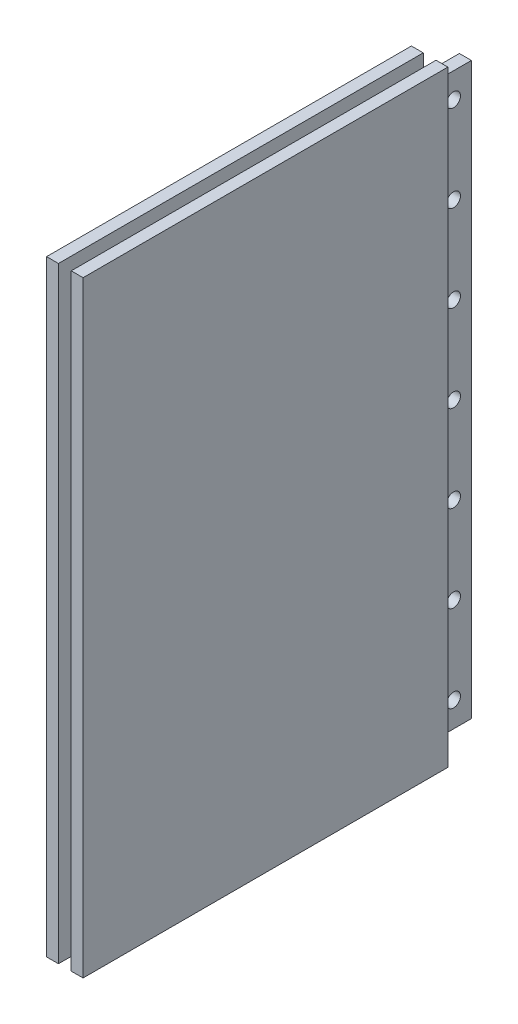
ISO-10303-21;
HEADER;
FILE_DESCRIPTION(('STEP AP214'),'2;1');
FILE_NAME('part.step','',(''),(''),'','','');
FILE_SCHEMA(('AUTOMOTIVE_DESIGN { 1 0 10303 214 1 1 1 1 }'));
ENDSEC;
DATA;
#1=APPLICATION_CONTEXT('core data for automotive mechanical design processes');
#2=APPLICATION_PROTOCOL_DEFINITION('international standard','automotive_design',2000,#1);
#3=PRODUCT_CONTEXT('',#1,'mechanical');
#4=PRODUCT('Part','Part','',(#3));
#5=PRODUCT_RELATED_PRODUCT_CATEGORY('part','',(#4));
#6=PRODUCT_DEFINITION_FORMATION('','',#4);
#7=PRODUCT_DEFINITION_CONTEXT('part definition',#1,'design');
#8=PRODUCT_DEFINITION('design','',#6,#7);
#9=PRODUCT_DEFINITION_SHAPE('','',#8);
#10=(LENGTH_UNIT() NAMED_UNIT(*) SI_UNIT(.MILLI.,.METRE.));
#11=(NAMED_UNIT(*) PLANE_ANGLE_UNIT() SI_UNIT($,.RADIAN.));
#12=(NAMED_UNIT(*) SI_UNIT($,.STERADIAN.) SOLID_ANGLE_UNIT());
#13=UNCERTAINTY_MEASURE_WITH_UNIT(LENGTH_MEASURE(1.E-05),#10,'distance_accuracy_value','');
#14=(GEOMETRIC_REPRESENTATION_CONTEXT(3) GLOBAL_UNCERTAINTY_ASSIGNED_CONTEXT((#13)) GLOBAL_UNIT_ASSIGNED_CONTEXT((#10,
#11,#12)) REPRESENTATION_CONTEXT('',''));
#15=CARTESIAN_POINT('',(0.,0.,0.));
#16=DIRECTION('',(0.,0.,1.));
#17=DIRECTION('',(1.,0.,0.));
#18=AXIS2_PLACEMENT_3D('',#15,#16,#17);
#19=CARTESIAN_POINT('',(-10.,0.,0.));
#20=DIRECTION('',(-1.,0.,0.));
#21=DIRECTION('',(0.,0.,1.));
#22=AXIS2_PLACEMENT_3D('',#19,#20,#21);
#23=PLANE('',#22);
#24=DIRECTION('',(0.,-1.,0.));
#25=VECTOR('',#24,1.);
#26=CARTESIAN_POINT('',(-10.,9.99999999999999,92.5));
#27=LINE('',#26,#25);
#28=CARTESIAN_POINT('',(-10.,158.75,92.5));
#29=VERTEX_POINT('',#28);
#30=CARTESIAN_POINT('',(-10.,7.49999999999996,92.5));
#31=VERTEX_POINT('',#30);
#32=EDGE_CURVE('E365',#29,#31,#27,.T.);
#33=ORIENTED_EDGE('',*,*,#32,.T.);
#34=DIRECTION('',(0.,0.,-1.));
#35=VECTOR('',#34,1.);
#36=CARTESIAN_POINT('',(-10.,7.49999999999997,0.));
#37=LINE('',#36,#35);
#38=CARTESIAN_POINT('',(-10.,7.49999999999997,2.49999999999997));
#39=VERTEX_POINT('',#38);
#40=EDGE_CURVE('E11',#31,#39,#37,.T.);
#41=ORIENTED_EDGE('',*,*,#40,.T.);
#42=DIRECTION('',(0.,1.,0.));
#43=VECTOR('',#42,1.);
#44=CARTESIAN_POINT('',(-10.,0.,2.49999999999997));
#45=LINE('',#44,#43);
#46=CARTESIAN_POINT('',(-10.,158.75,2.49999999999997));
#47=VERTEX_POINT('',#46);
#48=EDGE_CURVE('E51',#39,#47,#45,.T.);
#49=ORIENTED_EDGE('',*,*,#48,.T.);
#50=DIRECTION('',(0.,0.,1.));
#51=VECTOR('',#50,1.);
#52=CARTESIAN_POINT('',(-10.,158.75,90.));
#53=LINE('',#52,#51);
#54=EDGE_CURVE('E367',#47,#29,#53,.T.);
#55=ORIENTED_EDGE('',*,*,#54,.T.);
#56=EDGE_LOOP('',(#33,#41,#49,#55));
#57=FACE_BOUND('',#56,.T.);
#58=DIRECTION('',(0.,0.,-1.));
#59=VECTOR('',#58,1.);
#60=CARTESIAN_POINT('',(-10.,0.,0.));
#61=LINE('',#60,#59);
#62=CARTESIAN_POINT('',(-10.,0.,100.));
#63=VERTEX_POINT('',#62);
#64=CARTESIAN_POINT('',(-10.,0.,0.));
#65=VERTEX_POINT('',#64);
#66=EDGE_CURVE('E286',#63,#65,#61,.T.);
#67=ORIENTED_EDGE('',*,*,#66,.F.);
#68=DIRECTION('',(0.,-1.,0.));
#69=VECTOR('',#68,1.);
#70=CARTESIAN_POINT('',(-10.,0.,100.));
#71=LINE('',#70,#69);
#72=CARTESIAN_POINT('',(-10.,166.25,100.));
#73=VERTEX_POINT('',#72);
#74=EDGE_CURVE('E296',#73,#63,#71,.T.);
#75=ORIENTED_EDGE('',*,*,#74,.F.);
#76=DIRECTION('',(0.,0.,1.));
#77=VECTOR('',#76,1.);
#78=CARTESIAN_POINT('',(-10.,166.25,0.));
#79=LINE('',#78,#77);
#80=CARTESIAN_POINT('',(-10.,166.25,0.));
#81=VERTEX_POINT('',#80);
#82=EDGE_CURVE('E293',#81,#73,#79,.T.);
#83=ORIENTED_EDGE('',*,*,#82,.F.);
#84=DIRECTION('',(0.,1.,0.));
#85=VECTOR('',#84,1.);
#86=CARTESIAN_POINT('',(-10.,0.,0.));
#87=LINE('',#86,#85);
#88=EDGE_CURVE('E289',#65,#81,#87,.T.);
#89=ORIENTED_EDGE('',*,*,#88,.F.);
#90=EDGE_LOOP('',(#67,#75,#83,#89));
#91=FACE_BOUND('',#90,.T.);
#92=ADVANCED_FACE('F41',(#57,#91),#23,.T.);
#93=CARTESIAN_POINT('',(-10.,0.,100.));
#94=DIRECTION('',(0.,0.,1.));
#95=DIRECTION('',(1.,0.,0.));
#96=AXIS2_PLACEMENT_3D('',#93,#94,#95);
#97=PLANE('',#96);
#98=DIRECTION('',(1.,0.,0.));
#99=VECTOR('',#98,1.);
#100=CARTESIAN_POINT('',(-10.,0.,100.));
#101=LINE('',#100,#99);
#102=CARTESIAN_POINT('',(-6.74999999999999,0.,100.));
#103=VERTEX_POINT('',#102);
#104=EDGE_CURVE('E310',#63,#103,#101,.T.);
#105=ORIENTED_EDGE('',*,*,#104,.T.);
#106=DIRECTION('',(0.,1.,0.));
#107=VECTOR('',#106,1.);
#108=CARTESIAN_POINT('',(-6.74999999999999,161.25,100.));
#109=LINE('',#108,#107);
#110=CARTESIAN_POINT('',(-6.74999999999999,166.25,100.));
#111=VERTEX_POINT('',#110);
#112=EDGE_CURVE('E259',#103,#111,#109,.T.);
#113=ORIENTED_EDGE('',*,*,#112,.T.);
#114=DIRECTION('',(1.,0.,0.));
#115=VECTOR('',#114,1.);
#116=CARTESIAN_POINT('',(-10.,166.25,100.));
#117=LINE('',#116,#115);
#118=EDGE_CURVE('E315',#73,#111,#117,.T.);
#119=ORIENTED_EDGE('',*,*,#118,.F.);
#120=ORIENTED_EDGE('',*,*,#74,.T.);
#121=EDGE_LOOP('',(#105,#113,#119,#120));
#122=FACE_BOUND('',#121,.T.);
#123=ADVANCED_FACE('F377',(#122),#97,.T.);
#124=CARTESIAN_POINT('',(0.,161.25,0.));
#125=DIRECTION('',(0.,-1.,0.));
#126=DIRECTION('',(0.,0.,-1.));
#127=AXIS2_PLACEMENT_3D('',#124,#125,#126);
#128=PLANE('',#127);
#129=DIRECTION('',(-1.,0.,0.));
#130=VECTOR('',#129,1.);
#131=CARTESIAN_POINT('',(-6.75,161.25,95.));
#132=LINE('',#131,#130);
#133=CARTESIAN_POINT('',(-3.25,161.25,95.));
#134=VERTEX_POINT('',#133);
#135=CARTESIAN_POINT('',(-6.75,161.25,95.));
#136=VERTEX_POINT('',#135);
#137=EDGE_CURVE('E210',#134,#136,#132,.T.);
#138=ORIENTED_EDGE('',*,*,#137,.F.);
#139=DIRECTION('',(0.,0.,-1.));
#140=VECTOR('',#139,1.);
#141=CARTESIAN_POINT('',(-3.24999999999999,161.25,100.));
#142=LINE('',#141,#140);
#143=CARTESIAN_POINT('',(-3.25000000000001,161.25,0.));
#144=VERTEX_POINT('',#143);
#145=EDGE_CURVE('E257',#134,#144,#142,.T.);
#146=ORIENTED_EDGE('',*,*,#145,.T.);
#147=DIRECTION('',(-1.,0.,0.));
#148=VECTOR('',#147,1.);
#149=CARTESIAN_POINT('',(-10.,161.25,0.));
#150=LINE('',#149,#148);
#151=CARTESIAN_POINT('',(-3.35,161.25,0.));
#152=VERTEX_POINT('',#151);
#153=EDGE_CURVE('E264',#144,#152,#150,.T.);
#154=ORIENTED_EDGE('',*,*,#153,.T.);
#155=DIRECTION('',(0.,0.,-1.));
#156=VECTOR('',#155,1.);
#157=CARTESIAN_POINT('',(-3.35,161.25,-9.8));
#158=LINE('',#157,#156);
#159=CARTESIAN_POINT('',(-3.35,161.25,-9.8));
#160=VERTEX_POINT('',#159);
#161=EDGE_CURVE('E313',#152,#160,#158,.T.);
#162=ORIENTED_EDGE('',*,*,#161,.T.);
#163=DIRECTION('',(-1.,0.,0.));
#164=VECTOR('',#163,1.);
#165=CARTESIAN_POINT('',(-3.25000000000001,161.25,-9.8));
#166=LINE('',#165,#164);
#167=CARTESIAN_POINT('',(-6.65,161.25,-9.8));
#168=VERTEX_POINT('',#167);
#169=EDGE_CURVE('E250',#160,#168,#166,.T.);
#170=ORIENTED_EDGE('',*,*,#169,.T.);
#171=DIRECTION('',(0.,0.,1.));
#172=VECTOR('',#171,1.);
#173=CARTESIAN_POINT('',(-6.65,161.25,-9.8));
#174=LINE('',#173,#172);
#175=CARTESIAN_POINT('',(-6.65,161.25,0.));
#176=VERTEX_POINT('',#175);
#177=EDGE_CURVE('E269',#168,#176,#174,.T.);
#178=ORIENTED_EDGE('',*,*,#177,.T.);
#179=DIRECTION('',(-1.,0.,0.));
#180=VECTOR('',#179,1.);
#181=CARTESIAN_POINT('',(-10.,161.25,0.));
#182=LINE('',#181,#180);
#183=CARTESIAN_POINT('',(-6.75,161.25,0.));
#184=VERTEX_POINT('',#183);
#185=EDGE_CURVE('E272',#176,#184,#182,.T.);
#186=ORIENTED_EDGE('',*,*,#185,.T.);
#187=DIRECTION('',(0.,0.,1.));
#188=VECTOR('',#187,1.);
#189=CARTESIAN_POINT('',(-6.74999999999999,161.25,100.));
#190=LINE('',#189,#188);
#191=EDGE_CURVE('E253',#184,#136,#190,.T.);
#192=ORIENTED_EDGE('',*,*,#191,.T.);
#193=EDGE_LOOP('',(#138,#146,#154,#162,#170,#178,#186,#192));
#194=FACE_BOUND('',#193,.T.);
#195=ADVANCED_FACE('F401',(#194),#128,.F.);
#196=CARTESIAN_POINT('',(0.,5.,0.));
#197=DIRECTION('',(0.,1.,0.));
#198=DIRECTION('',(0.,0.,-1.));
#199=AXIS2_PLACEMENT_3D('',#196,#197,#198);
#200=PLANE('',#199);
#201=DIRECTION('',(1.,0.,0.));
#202=VECTOR('',#201,1.);
#203=CARTESIAN_POINT('',(-6.75,5.,95.));
#204=LINE('',#203,#202);
#205=CARTESIAN_POINT('',(-6.74999999999999,5.,95.));
#206=VERTEX_POINT('',#205);
#207=CARTESIAN_POINT('',(-3.25,5.,95.));
#208=VERTEX_POINT('',#207);
#209=EDGE_CURVE('E205',#206,#208,#204,.T.);
#210=ORIENTED_EDGE('',*,*,#209,.F.);
#211=DIRECTION('',(0.,0.,1.));
#212=VECTOR('',#211,1.);
#213=CARTESIAN_POINT('',(-6.74999999999999,5.,100.));
#214=LINE('',#213,#212);
#215=CARTESIAN_POINT('',(-6.75,5.,0.));
#216=VERTEX_POINT('',#215);
#217=EDGE_CURVE('E232',#216,#206,#214,.T.);
#218=ORIENTED_EDGE('',*,*,#217,.F.);
#219=DIRECTION('',(1.,0.,0.));
#220=VECTOR('',#219,1.);
#221=CARTESIAN_POINT('',(-10.,5.,0.));
#222=LINE('',#221,#220);
#223=CARTESIAN_POINT('',(-6.65,5.,0.));
#224=VERTEX_POINT('',#223);
#225=EDGE_CURVE('E244',#216,#224,#222,.T.);
#226=ORIENTED_EDGE('',*,*,#225,.T.);
#227=DIRECTION('',(0.,0.,-1.));
#228=VECTOR('',#227,1.);
#229=CARTESIAN_POINT('',(-6.65,5.,-9.8));
#230=LINE('',#229,#228);
#231=CARTESIAN_POINT('',(-6.65,5.,-9.8));
#232=VERTEX_POINT('',#231);
#233=EDGE_CURVE('E242',#224,#232,#230,.T.);
#234=ORIENTED_EDGE('',*,*,#233,.T.);
#235=DIRECTION('',(-1.,0.,0.));
#236=VECTOR('',#235,1.);
#237=CARTESIAN_POINT('',(-3.25000000000001,5.,-9.8));
#238=LINE('',#237,#236);
#239=CARTESIAN_POINT('',(-3.35,5.,-9.8));
#240=VERTEX_POINT('',#239);
#241=EDGE_CURVE('E226',#240,#232,#238,.T.);
#242=ORIENTED_EDGE('',*,*,#241,.F.);
#243=DIRECTION('',(0.,0.,1.));
#244=VECTOR('',#243,1.);
#245=CARTESIAN_POINT('',(-3.35,5.,-9.8));
#246=LINE('',#245,#244);
#247=CARTESIAN_POINT('',(-3.35,5.,0.));
#248=VERTEX_POINT('',#247);
#249=EDGE_CURVE('E330',#240,#248,#246,.T.);
#250=ORIENTED_EDGE('',*,*,#249,.T.);
#251=DIRECTION('',(1.,0.,0.));
#252=VECTOR('',#251,1.);
#253=CARTESIAN_POINT('',(-10.,5.,0.));
#254=LINE('',#253,#252);
#255=CARTESIAN_POINT('',(-3.25000000000001,5.,0.));
#256=VERTEX_POINT('',#255);
#257=EDGE_CURVE('E235',#248,#256,#254,.T.);
#258=ORIENTED_EDGE('',*,*,#257,.T.);
#259=DIRECTION('',(0.,0.,-1.));
#260=VECTOR('',#259,1.);
#261=CARTESIAN_POINT('',(-3.24999999999999,5.,100.));
#262=LINE('',#261,#260);
#263=EDGE_CURVE('E229',#208,#256,#262,.T.);
#264=ORIENTED_EDGE('',*,*,#263,.F.);
#265=EDGE_LOOP('',(#210,#218,#226,#234,#242,#250,#258,#264));
#266=FACE_BOUND('',#265,.T.);
#267=ADVANCED_FACE('F411',(#266),#200,.F.);
#268=CARTESIAN_POINT('',(-10.001,154.375,-4.9));
#269=DIRECTION('',(1.,0.,0.));
#270=DIRECTION('',(0.,0.,-1.));
#271=AXIS2_PLACEMENT_3D('',#268,#269,#270);
#272=CYLINDRICAL_SURFACE('',#271,1.9);
#273=CARTESIAN_POINT('',(-6.65,154.375,-4.9));
#274=DIRECTION('',(-1.,0.,0.));
#275=DIRECTION('',(0.,0.,1.));
#276=AXIS2_PLACEMENT_3D('',#273,#274,#275);
#277=CIRCLE('',#276,1.9);
#278=CARTESIAN_POINT('',(-6.65,154.375,-3.));
#279=VERTEX_POINT('',#278);
#280=EDGE_CURVE('E359',#279,#279,#277,.F.);
#281=ORIENTED_EDGE('',*,*,#280,.F.);
#282=EDGE_LOOP('',(#281));
#283=FACE_BOUND('',#282,.T.);
#284=CARTESIAN_POINT('',(-3.35,154.375,-4.9));
#285=DIRECTION('',(1.,0.,0.));
#286=DIRECTION('',(0.,0.,-1.));
#287=AXIS2_PLACEMENT_3D('',#284,#285,#286);
#288=CIRCLE('',#287,1.9);
#289=CARTESIAN_POINT('',(-3.35,154.375,-6.8));
#290=VERTEX_POINT('',#289);
#291=EDGE_CURVE('E362',#290,#290,#288,.T.);
#292=ORIENTED_EDGE('',*,*,#291,.T.);
#293=EDGE_LOOP('',(#292));
#294=FACE_BOUND('',#293,.T.);
#295=ADVANCED_FACE('F453',(#283,#294),#272,.F.);
#296=CARTESIAN_POINT('',(-10.001,130.625,-4.9));
#297=DIRECTION('',(1.,0.,0.));
#298=DIRECTION('',(0.,0.,-1.));
#299=AXIS2_PLACEMENT_3D('',#296,#297,#298);
#300=CYLINDRICAL_SURFACE('',#299,1.9);
#301=CARTESIAN_POINT('',(-6.65,130.625,-4.9));
#302=DIRECTION('',(-1.,0.,0.));
#303=DIRECTION('',(0.,0.,1.));
#304=AXIS2_PLACEMENT_3D('',#301,#302,#303);
#305=CIRCLE('',#304,1.9);
#306=CARTESIAN_POINT('',(-6.65,130.625,-3.));
#307=VERTEX_POINT('',#306);
#308=EDGE_CURVE('E353',#307,#307,#305,.F.);
#309=ORIENTED_EDGE('',*,*,#308,.F.);
#310=EDGE_LOOP('',(#309));
#311=FACE_BOUND('',#310,.T.);
#312=CARTESIAN_POINT('',(-3.35,130.625,-4.9));
#313=DIRECTION('',(1.,0.,0.));
#314=DIRECTION('',(0.,0.,-1.));
#315=AXIS2_PLACEMENT_3D('',#312,#313,#314);
#316=CIRCLE('',#315,1.9);
#317=CARTESIAN_POINT('',(-3.35,130.625,-6.8));
#318=VERTEX_POINT('',#317);
#319=EDGE_CURVE('E356',#318,#318,#316,.T.);
#320=ORIENTED_EDGE('',*,*,#319,.T.);
#321=EDGE_LOOP('',(#320));
#322=FACE_BOUND('',#321,.T.);
#323=ADVANCED_FACE('F494',(#311,#322),#300,.F.);
#324=CARTESIAN_POINT('',(-10.001,106.875,-4.9));
#325=DIRECTION('',(1.,0.,0.));
#326=DIRECTION('',(0.,0.,-1.));
#327=AXIS2_PLACEMENT_3D('',#324,#325,#326);
#328=CYLINDRICAL_SURFACE('',#327,1.9);
#329=CARTESIAN_POINT('',(-6.65,106.875,-4.9));
#330=DIRECTION('',(-1.,0.,0.));
#331=DIRECTION('',(0.,0.,1.));
#332=AXIS2_PLACEMENT_3D('',#329,#330,#331);
#333=CIRCLE('',#332,1.9);
#334=CARTESIAN_POINT('',(-6.65,106.875,-3.));
#335=VERTEX_POINT('',#334);
#336=EDGE_CURVE('E347',#335,#335,#333,.F.);
#337=ORIENTED_EDGE('',*,*,#336,.F.);
#338=EDGE_LOOP('',(#337));
#339=FACE_BOUND('',#338,.T.);
#340=CARTESIAN_POINT('',(-3.35,106.875,-4.9));
#341=DIRECTION('',(1.,0.,0.));
#342=DIRECTION('',(0.,0.,-1.));
#343=AXIS2_PLACEMENT_3D('',#340,#341,#342);
#344=CIRCLE('',#343,1.9);
#345=CARTESIAN_POINT('',(-3.35,106.875,-6.8));
#346=VERTEX_POINT('',#345);
#347=EDGE_CURVE('E350',#346,#346,#344,.T.);
#348=ORIENTED_EDGE('',*,*,#347,.T.);
#349=EDGE_LOOP('',(#348));
#350=FACE_BOUND('',#349,.T.);
#351=ADVANCED_FACE('F490',(#339,#350),#328,.F.);
#352=CARTESIAN_POINT('',(-10.001,83.125,-4.9));
#353=DIRECTION('',(1.,0.,0.));
#354=DIRECTION('',(0.,0.,-1.));
#355=AXIS2_PLACEMENT_3D('',#352,#353,#354);
#356=CYLINDRICAL_SURFACE('',#355,1.9);
#357=CARTESIAN_POINT('',(-6.65,83.125,-4.9));
#358=DIRECTION('',(-1.,0.,0.));
#359=DIRECTION('',(0.,0.,1.));
#360=AXIS2_PLACEMENT_3D('',#357,#358,#359);
#361=CIRCLE('',#360,1.9);
#362=CARTESIAN_POINT('',(-6.65,83.125,-3.));
#363=VERTEX_POINT('',#362);
#364=EDGE_CURVE('E341',#363,#363,#361,.F.);
#365=ORIENTED_EDGE('',*,*,#364,.F.);
#366=EDGE_LOOP('',(#365));
#367=FACE_BOUND('',#366,.T.);
#368=CARTESIAN_POINT('',(-3.35,83.125,-4.9));
#369=DIRECTION('',(1.,0.,0.));
#370=DIRECTION('',(0.,0.,-1.));
#371=AXIS2_PLACEMENT_3D('',#368,#369,#370);
#372=CIRCLE('',#371,1.9);
#373=CARTESIAN_POINT('',(-3.35,83.125,-6.8));
#374=VERTEX_POINT('',#373);
#375=EDGE_CURVE('E344',#374,#374,#372,.T.);
#376=ORIENTED_EDGE('',*,*,#375,.T.);
#377=EDGE_LOOP('',(#376));
#378=FACE_BOUND('',#377,.T.);
#379=ADVANCED_FACE('F486',(#367,#378),#356,.F.);
#380=CARTESIAN_POINT('',(-10.001,59.375,-4.9));
#381=DIRECTION('',(1.,0.,0.));
#382=DIRECTION('',(0.,0.,-1.));
#383=AXIS2_PLACEMENT_3D('',#380,#381,#382);
#384=CYLINDRICAL_SURFACE('',#383,1.9);
#385=CARTESIAN_POINT('',(-6.65,59.375,-4.9));
#386=DIRECTION('',(-1.,0.,0.));
#387=DIRECTION('',(0.,0.,1.));
#388=AXIS2_PLACEMENT_3D('',#385,#386,#387);
#389=CIRCLE('',#388,1.9);
#390=CARTESIAN_POINT('',(-6.65,59.375,-3.));
#391=VERTEX_POINT('',#390);
#392=EDGE_CURVE('E335',#391,#391,#389,.F.);
#393=ORIENTED_EDGE('',*,*,#392,.F.);
#394=EDGE_LOOP('',(#393));
#395=FACE_BOUND('',#394,.T.);
#396=CARTESIAN_POINT('',(-3.35,59.375,-4.9));
#397=DIRECTION('',(1.,0.,0.));
#398=DIRECTION('',(0.,0.,-1.));
#399=AXIS2_PLACEMENT_3D('',#396,#397,#398);
#400=CIRCLE('',#399,1.9);
#401=CARTESIAN_POINT('',(-3.35,59.375,-6.8));
#402=VERTEX_POINT('',#401);
#403=EDGE_CURVE('E338',#402,#402,#400,.T.);
#404=ORIENTED_EDGE('',*,*,#403,.T.);
#405=EDGE_LOOP('',(#404));
#406=FACE_BOUND('',#405,.T.);
#407=ADVANCED_FACE('F481',(#395,#406),#384,.F.);
#408=CARTESIAN_POINT('',(-10.,0.,0.));
#409=DIRECTION('',(0.,0.,-1.));
#410=DIRECTION('',(-1.,0.,0.));
#411=AXIS2_PLACEMENT_3D('',#408,#409,#410);
#412=PLANE('',#411);
#413=DIRECTION('',(1.,0.,0.));
#414=VECTOR('',#413,1.);
#415=CARTESIAN_POINT('',(-10.,0.,0.));
#416=LINE('',#415,#414);
#417=CARTESIAN_POINT('',(-3.25000000000001,0.,0.));
#418=VERTEX_POINT('',#417);
#419=CARTESIAN_POINT('',(0.,0.,0.));
#420=VERTEX_POINT('',#419);
#421=EDGE_CURVE('E299',#418,#420,#416,.T.);
#422=ORIENTED_EDGE('',*,*,#421,.F.);
#423=DIRECTION('',(0.,1.,0.));
#424=VECTOR('',#423,1.);
#425=CARTESIAN_POINT('',(-3.25000000000001,0.,0.));
#426=LINE('',#425,#424);
#427=EDGE_CURVE('E246',#418,#256,#426,.T.);
#428=ORIENTED_EDGE('',*,*,#427,.T.);
#429=ORIENTED_EDGE('',*,*,#257,.F.);
#430=DIRECTION('',(0.,1.,0.));
#431=VECTOR('',#430,1.);
#432=CARTESIAN_POINT('',(-3.35,-10.340696301507,0.));
#433=LINE('',#432,#431);
#434=EDGE_CURVE('E278',#248,#152,#433,.T.);
#435=ORIENTED_EDGE('',*,*,#434,.T.);
#436=ORIENTED_EDGE('',*,*,#153,.F.);
#437=DIRECTION('',(0.,-1.,0.));
#438=VECTOR('',#437,1.);
#439=CARTESIAN_POINT('',(-3.25000000000001,0.,0.));
#440=LINE('',#439,#438);
#441=CARTESIAN_POINT('',(-3.25000000000001,166.25,0.));
#442=VERTEX_POINT('',#441);
#443=EDGE_CURVE('E274',#442,#144,#440,.T.);
#444=ORIENTED_EDGE('',*,*,#443,.F.);
#445=DIRECTION('',(1.,0.,0.));
#446=VECTOR('',#445,1.);
#447=CARTESIAN_POINT('',(-10.,166.25,0.));
#448=LINE('',#447,#446);
#449=CARTESIAN_POINT('',(0.,166.25,0.));
#450=VERTEX_POINT('',#449);
#451=EDGE_CURVE('E322',#442,#450,#448,.T.);
#452=ORIENTED_EDGE('',*,*,#451,.T.);
#453=DIRECTION('',(0.,1.,0.));
#454=VECTOR('',#453,1.);
#455=CARTESIAN_POINT('',(0.,0.,0.));
#456=LINE('',#455,#454);
#457=EDGE_CURVE('E302',#420,#450,#456,.T.);
#458=ORIENTED_EDGE('',*,*,#457,.F.);
#459=EDGE_LOOP('',(#422,#428,#429,#435,#436,#444,#452,#458));
#460=FACE_BOUND('',#459,.T.);
#461=ADVANCED_FACE('F426',(#460),#412,.T.);
#462=CARTESIAN_POINT('',(-10.,0.,0.));
#463=DIRECTION('',(0.,-1.,0.));
#464=DIRECTION('',(0.,0.,-1.));
#465=AXIS2_PLACEMENT_3D('',#462,#463,#464);
#466=PLANE('',#465);
#467=CARTESIAN_POINT('',(-6.75,0.,0.));
#468=VERTEX_POINT('',#467);
#469=EDGE_CURVE('E323',#65,#468,#416,.T.);
#470=ORIENTED_EDGE('',*,*,#469,.T.);
#471=DIRECTION('',(0.,0.,1.));
#472=VECTOR('',#471,1.);
#473=CARTESIAN_POINT('',(-6.74999999999999,0.,100.));
#474=LINE('',#473,#472);
#475=EDGE_CURVE('E230',#468,#103,#474,.T.);
#476=ORIENTED_EDGE('',*,*,#475,.T.);
#477=ORIENTED_EDGE('',*,*,#104,.F.);
#478=ORIENTED_EDGE('',*,*,#66,.T.);
#479=EDGE_LOOP('',(#470,#476,#477,#478));
#480=FACE_BOUND('',#479,.T.);
#481=ADVANCED_FACE('F392',(#480),#466,.T.);
#482=CARTESIAN_POINT('',(-3.24999999999999,0.,100.));
#483=VERTEX_POINT('',#482);
#484=CARTESIAN_POINT('',(0.,0.,100.));
#485=VERTEX_POINT('',#484);
#486=EDGE_CURVE('E314',#483,#485,#101,.T.);
#487=ORIENTED_EDGE('',*,*,#486,.F.);
#488=DIRECTION('',(0.,0.,-1.));
#489=VECTOR('',#488,1.);
#490=CARTESIAN_POINT('',(-3.24999999999999,0.,100.));
#491=LINE('',#490,#489);
#492=EDGE_CURVE('E223',#483,#418,#491,.T.);
#493=ORIENTED_EDGE('',*,*,#492,.T.);
#494=ORIENTED_EDGE('',*,*,#421,.T.);
#495=DIRECTION('',(0.,0.,-1.));
#496=VECTOR('',#495,1.);
#497=CARTESIAN_POINT('',(0.,0.,0.));
#498=LINE('',#497,#496);
#499=EDGE_CURVE('E285',#485,#420,#498,.T.);
#500=ORIENTED_EDGE('',*,*,#499,.F.);
#501=EDGE_LOOP('',(#487,#493,#494,#500));
#502=FACE_BOUND('',#501,.T.);
#503=ADVANCED_FACE('F474',(#502),#466,.T.);
#504=DIRECTION('',(0.,1.,0.));
#505=VECTOR('',#504,1.);
#506=CARTESIAN_POINT('',(-3.24999999999999,161.25,100.));
#507=LINE('',#506,#505);
#508=CARTESIAN_POINT('',(-3.24999999999999,166.25,100.));
#509=VERTEX_POINT('',#508);
#510=EDGE_CURVE('E262',#483,#509,#507,.T.);
#511=ORIENTED_EDGE('',*,*,#510,.F.);
#512=ORIENTED_EDGE('',*,*,#486,.T.);
#513=DIRECTION('',(0.,-1.,0.));
#514=VECTOR('',#513,1.);
#515=CARTESIAN_POINT('',(0.,0.,100.));
#516=LINE('',#515,#514);
#517=CARTESIAN_POINT('',(0.,166.25,100.));
#518=VERTEX_POINT('',#517);
#519=EDGE_CURVE('E290',#518,#485,#516,.T.);
#520=ORIENTED_EDGE('',*,*,#519,.F.);
#521=EDGE_CURVE('E318',#509,#518,#117,.T.);
#522=ORIENTED_EDGE('',*,*,#521,.F.);
#523=EDGE_LOOP('',(#511,#512,#520,#522));
#524=FACE_BOUND('',#523,.T.);
#525=ADVANCED_FACE('F471',(#524),#97,.T.);
#526=ORIENTED_EDGE('',*,*,#225,.F.);
#527=DIRECTION('',(0.,-1.,0.));
#528=VECTOR('',#527,1.);
#529=CARTESIAN_POINT('',(-6.75,0.,0.));
#530=LINE('',#529,#528);
#531=EDGE_CURVE('E332',#216,#468,#530,.T.);
#532=ORIENTED_EDGE('',*,*,#531,.T.);
#533=ORIENTED_EDGE('',*,*,#469,.F.);
#534=ORIENTED_EDGE('',*,*,#88,.T.);
#535=CARTESIAN_POINT('',(-6.75,166.25,0.));
#536=VERTEX_POINT('',#535);
#537=EDGE_CURVE('E319',#81,#536,#448,.T.);
#538=ORIENTED_EDGE('',*,*,#537,.T.);
#539=DIRECTION('',(0.,1.,0.));
#540=VECTOR('',#539,1.);
#541=CARTESIAN_POINT('',(-6.75,0.,0.));
#542=LINE('',#541,#540);
#543=EDGE_CURVE('E328',#184,#536,#542,.T.);
#544=ORIENTED_EDGE('',*,*,#543,.F.);
#545=ORIENTED_EDGE('',*,*,#185,.F.);
#546=DIRECTION('',(0.,1.,0.));
#547=VECTOR('',#546,1.);
#548=CARTESIAN_POINT('',(-6.65,-10.340696301507,0.));
#549=LINE('',#548,#547);
#550=EDGE_CURVE('E281',#224,#176,#549,.T.);
#551=ORIENTED_EDGE('',*,*,#550,.F.);
#552=EDGE_LOOP('',(#526,#532,#533,#534,#538,#544,#545,#551));
#553=FACE_BOUND('',#552,.T.);
#554=ADVANCED_FACE('F390',(#553),#412,.T.);
#555=CARTESIAN_POINT('',(-10.,166.25,0.));
#556=DIRECTION('',(0.,1.,0.));
#557=DIRECTION('',(0.,0.,1.));
#558=AXIS2_PLACEMENT_3D('',#555,#556,#557);
#559=PLANE('',#558);
#560=DIRECTION('',(0.,0.,-1.));
#561=VECTOR('',#560,1.);
#562=CARTESIAN_POINT('',(-3.24999999999999,166.25,100.));
#563=LINE('',#562,#561);
#564=EDGE_CURVE('E254',#509,#442,#563,.T.);
#565=ORIENTED_EDGE('',*,*,#564,.F.);
#566=ORIENTED_EDGE('',*,*,#521,.T.);
#567=DIRECTION('',(0.,0.,1.));
#568=VECTOR('',#567,1.);
#569=CARTESIAN_POINT('',(0.,166.25,0.));
#570=LINE('',#569,#568);
#571=EDGE_CURVE('E305',#450,#518,#570,.T.);
#572=ORIENTED_EDGE('',*,*,#571,.F.);
#573=ORIENTED_EDGE('',*,*,#451,.F.);
#574=EDGE_LOOP('',(#565,#566,#572,#573));
#575=FACE_BOUND('',#574,.T.);
#576=ADVANCED_FACE('F478',(#575),#559,.T.);
#577=DIRECTION('',(0.,0.,1.));
#578=VECTOR('',#577,1.);
#579=CARTESIAN_POINT('',(-6.74999999999999,166.25,100.));
#580=LINE('',#579,#578);
#581=EDGE_CURVE('E249',#536,#111,#580,.T.);
#582=ORIENTED_EDGE('',*,*,#581,.F.);
#583=ORIENTED_EDGE('',*,*,#537,.F.);
#584=ORIENTED_EDGE('',*,*,#82,.T.);
#585=ORIENTED_EDGE('',*,*,#118,.T.);
#586=EDGE_LOOP('',(#582,#583,#584,#585));
#587=FACE_BOUND('',#586,.T.);
#588=ADVANCED_FACE('F387',(#587),#559,.T.);
#589=CARTESIAN_POINT('',(0.,0.,0.));
#590=DIRECTION('',(-1.,0.,0.));
#591=DIRECTION('',(0.,0.,1.));
#592=AXIS2_PLACEMENT_3D('',#589,#590,#591);
#593=PLANE('',#592);
#594=ORIENTED_EDGE('',*,*,#499,.T.);
#595=ORIENTED_EDGE('',*,*,#457,.T.);
#596=ORIENTED_EDGE('',*,*,#571,.T.);
#597=ORIENTED_EDGE('',*,*,#519,.T.);
#598=EDGE_LOOP('',(#594,#595,#596,#597));
#599=FACE_BOUND('',#598,.T.);
#600=ADVANCED_FACE('F466',(#599),#593,.F.);
#601=CARTESIAN_POINT('',(-6.65,-10.340696301507,-9.8));
#602=DIRECTION('',(0.,0.,-1.));
#603=DIRECTION('',(-1.,0.,0.));
#604=AXIS2_PLACEMENT_3D('',#601,#602,#603);
#605=PLANE('',#604);
#606=ORIENTED_EDGE('',*,*,#241,.T.);
#607=DIRECTION('',(0.,1.,0.));
#608=VECTOR('',#607,1.);
#609=CARTESIAN_POINT('',(-6.65,-10.340696301507,-9.8));
#610=LINE('',#609,#608);
#611=EDGE_CURVE('E277',#232,#168,#610,.T.);
#612=ORIENTED_EDGE('',*,*,#611,.T.);
#613=ORIENTED_EDGE('',*,*,#169,.F.);
#614=DIRECTION('',(0.,1.,0.));
#615=VECTOR('',#614,1.);
#616=CARTESIAN_POINT('',(-3.35,-10.340696301507,-9.8));
#617=LINE('',#616,#615);
#618=EDGE_CURVE('E280',#240,#160,#617,.T.);
#619=ORIENTED_EDGE('',*,*,#618,.F.);
#620=EDGE_LOOP('',(#606,#612,#613,#619));
#621=FACE_BOUND('',#620,.T.);
#622=ADVANCED_FACE('F415',(#621),#605,.T.);
#623=CARTESIAN_POINT('',(-6.65,-10.340696301507,-9.8));
#624=DIRECTION('',(-1.,0.,0.));
#625=DIRECTION('',(0.,0.,1.));
#626=AXIS2_PLACEMENT_3D('',#623,#624,#625);
#627=PLANE('',#626);
#628=CARTESIAN_POINT('',(-6.65,35.625,-4.9));
#629=DIRECTION('',(-1.,0.,0.));
#630=DIRECTION('',(0.,0.,1.));
#631=AXIS2_PLACEMENT_3D('',#628,#629,#630);
#632=CIRCLE('',#631,1.9);
#633=CARTESIAN_POINT('',(-6.65,35.625,-3.));
#634=VERTEX_POINT('',#633);
#635=EDGE_CURVE('E213',#634,#634,#632,.F.);
#636=ORIENTED_EDGE('',*,*,#635,.T.);
#637=EDGE_LOOP('',(#636));
#638=FACE_BOUND('',#637,.T.);
#639=CARTESIAN_POINT('',(-6.65,11.875,-4.9));
#640=DIRECTION('',(-1.,0.,0.));
#641=DIRECTION('',(0.,0.,1.));
#642=AXIS2_PLACEMENT_3D('',#639,#640,#641);
#643=CIRCLE('',#642,1.9);
#644=CARTESIAN_POINT('',(-6.65,11.875,-3.));
#645=VERTEX_POINT('',#644);
#646=EDGE_CURVE('E219',#645,#645,#643,.F.);
#647=ORIENTED_EDGE('',*,*,#646,.T.);
#648=EDGE_LOOP('',(#647));
#649=FACE_BOUND('',#648,.T.);
#650=ORIENTED_EDGE('',*,*,#233,.F.);
#651=ORIENTED_EDGE('',*,*,#550,.T.);
#652=ORIENTED_EDGE('',*,*,#177,.F.);
#653=ORIENTED_EDGE('',*,*,#611,.F.);
#654=EDGE_LOOP('',(#650,#651,#652,#653));
#655=FACE_BOUND('',#654,.T.);
#656=ORIENTED_EDGE('',*,*,#392,.T.);
#657=EDGE_LOOP('',(#656));
#658=FACE_BOUND('',#657,.T.);
#659=ORIENTED_EDGE('',*,*,#364,.T.);
#660=EDGE_LOOP('',(#659));
#661=FACE_BOUND('',#660,.T.);
#662=ORIENTED_EDGE('',*,*,#336,.T.);
#663=EDGE_LOOP('',(#662));
#664=FACE_BOUND('',#663,.T.);
#665=ORIENTED_EDGE('',*,*,#308,.T.);
#666=EDGE_LOOP('',(#665));
#667=FACE_BOUND('',#666,.T.);
#668=ORIENTED_EDGE('',*,*,#280,.T.);
#669=EDGE_LOOP('',(#668));
#670=FACE_BOUND('',#669,.T.);
#671=ADVANCED_FACE('F407',(#638,#649,#655,#658,#661,#664,#667,#670),#627,.T.);
#672=CARTESIAN_POINT('',(-3.35,-10.340696301507,-9.8));
#673=DIRECTION('',(1.,0.,0.));
#674=DIRECTION('',(0.,0.,-1.));
#675=AXIS2_PLACEMENT_3D('',#672,#673,#674);
#676=PLANE('',#675);
#677=CARTESIAN_POINT('',(-3.35,35.625,-4.9));
#678=DIRECTION('',(1.,0.,0.));
#679=DIRECTION('',(0.,0.,-1.));
#680=AXIS2_PLACEMENT_3D('',#677,#678,#679);
#681=CIRCLE('',#680,1.9);
#682=CARTESIAN_POINT('',(-3.35,35.625,-6.8));
#683=VERTEX_POINT('',#682);
#684=EDGE_CURVE('E216',#683,#683,#681,.T.);
#685=ORIENTED_EDGE('',*,*,#684,.F.);
#686=EDGE_LOOP('',(#685));
#687=FACE_BOUND('',#686,.T.);
#688=CARTESIAN_POINT('',(-3.35,11.875,-4.9));
#689=DIRECTION('',(1.,0.,0.));
#690=DIRECTION('',(0.,0.,-1.));
#691=AXIS2_PLACEMENT_3D('',#688,#689,#690);
#692=CIRCLE('',#691,1.9);
#693=CARTESIAN_POINT('',(-3.35,11.875,-6.8));
#694=VERTEX_POINT('',#693);
#695=EDGE_CURVE('E220',#694,#694,#692,.T.);
#696=ORIENTED_EDGE('',*,*,#695,.F.);
#697=EDGE_LOOP('',(#696));
#698=FACE_BOUND('',#697,.T.);
#699=ORIENTED_EDGE('',*,*,#249,.F.);
#700=ORIENTED_EDGE('',*,*,#618,.T.);
#701=ORIENTED_EDGE('',*,*,#161,.F.);
#702=ORIENTED_EDGE('',*,*,#434,.F.);
#703=EDGE_LOOP('',(#699,#700,#701,#702));
#704=FACE_BOUND('',#703,.T.);
#705=ORIENTED_EDGE('',*,*,#403,.F.);
#706=EDGE_LOOP('',(#705));
#707=FACE_BOUND('',#706,.T.);
#708=ORIENTED_EDGE('',*,*,#375,.F.);
#709=EDGE_LOOP('',(#708));
#710=FACE_BOUND('',#709,.T.);
#711=ORIENTED_EDGE('',*,*,#347,.F.);
#712=EDGE_LOOP('',(#711));
#713=FACE_BOUND('',#712,.T.);
#714=ORIENTED_EDGE('',*,*,#319,.F.);
#715=EDGE_LOOP('',(#714));
#716=FACE_BOUND('',#715,.T.);
#717=ORIENTED_EDGE('',*,*,#291,.F.);
#718=EDGE_LOOP('',(#717));
#719=FACE_BOUND('',#718,.T.);
#720=ADVANCED_FACE('F418',(#687,#698,#704,#707,#710,#713,#716,#719),#676,.T.);
#721=CARTESIAN_POINT('',(-3.24999999999999,161.25,100.));
#722=DIRECTION('',(1.,0.,0.));
#723=DIRECTION('',(0.,0.,-1.));
#724=AXIS2_PLACEMENT_3D('',#721,#722,#723);
#725=PLANE('',#724);
#726=ORIENTED_EDGE('',*,*,#443,.T.);
#727=ORIENTED_EDGE('',*,*,#145,.F.);
#728=DIRECTION('',(0.,1.,0.));
#729=VECTOR('',#728,1.);
#730=CARTESIAN_POINT('',(-3.25,161.25,95.));
#731=LINE('',#730,#729);
#732=EDGE_CURVE('E208',#208,#134,#731,.T.);
#733=ORIENTED_EDGE('',*,*,#732,.F.);
#734=ORIENTED_EDGE('',*,*,#263,.T.);
#735=ORIENTED_EDGE('',*,*,#427,.F.);
#736=ORIENTED_EDGE('',*,*,#492,.F.);
#737=ORIENTED_EDGE('',*,*,#510,.T.);
#738=ORIENTED_EDGE('',*,*,#564,.T.);
#739=EDGE_LOOP('',(#726,#727,#733,#734,#735,#736,#737,#738));
#740=FACE_BOUND('',#739,.T.);
#741=ADVANCED_FACE('F431',(#740),#725,.F.);
#742=CARTESIAN_POINT('',(-6.74999999999999,161.25,100.));
#743=DIRECTION('',(-1.,0.,0.));
#744=DIRECTION('',(0.,0.,1.));
#745=AXIS2_PLACEMENT_3D('',#742,#743,#744);
#746=PLANE('',#745);
#747=ORIENTED_EDGE('',*,*,#543,.T.);
#748=ORIENTED_EDGE('',*,*,#581,.T.);
#749=ORIENTED_EDGE('',*,*,#112,.F.);
#750=ORIENTED_EDGE('',*,*,#475,.F.);
#751=ORIENTED_EDGE('',*,*,#531,.F.);
#752=ORIENTED_EDGE('',*,*,#217,.T.);
#753=DIRECTION('',(0.,-1.,0.));
#754=VECTOR('',#753,1.);
#755=CARTESIAN_POINT('',(-6.75,161.25,95.));
#756=LINE('',#755,#754);
#757=EDGE_CURVE('E203',#136,#206,#756,.T.);
#758=ORIENTED_EDGE('',*,*,#757,.F.);
#759=ORIENTED_EDGE('',*,*,#191,.F.);
#760=EDGE_LOOP('',(#747,#748,#749,#750,#751,#752,#758,#759));
#761=FACE_BOUND('',#760,.T.);
#762=ADVANCED_FACE('F394',(#761),#746,.F.);
#763=CARTESIAN_POINT('',(-10.001,11.875,-4.9));
#764=DIRECTION('',(1.,0.,0.));
#765=DIRECTION('',(0.,0.,-1.));
#766=AXIS2_PLACEMENT_3D('',#763,#764,#765);
#767=CYLINDRICAL_SURFACE('',#766,1.9);
#768=ORIENTED_EDGE('',*,*,#646,.F.);
#769=EDGE_LOOP('',(#768));
#770=FACE_BOUND('',#769,.T.);
#771=ORIENTED_EDGE('',*,*,#695,.T.);
#772=EDGE_LOOP('',(#771));
#773=FACE_BOUND('',#772,.T.);
#774=ADVANCED_FACE('F444',(#770,#773),#767,.F.);
#775=CARTESIAN_POINT('',(-10.001,35.625,-4.9));
#776=DIRECTION('',(1.,0.,0.));
#777=DIRECTION('',(0.,0.,-1.));
#778=AXIS2_PLACEMENT_3D('',#775,#776,#777);
#779=CYLINDRICAL_SURFACE('',#778,1.9);
#780=ORIENTED_EDGE('',*,*,#635,.F.);
#781=EDGE_LOOP('',(#780));
#782=FACE_BOUND('',#781,.T.);
#783=ORIENTED_EDGE('',*,*,#684,.T.);
#784=EDGE_LOOP('',(#783));
#785=FACE_BOUND('',#784,.T.);
#786=ADVANCED_FACE('F436',(#782,#785),#779,.F.);
#787=CARTESIAN_POINT('',(0.,0.,95.));
#788=DIRECTION('',(0.,0.,1.));
#789=DIRECTION('',(1.,0.,0.));
#790=AXIS2_PLACEMENT_3D('',#787,#788,#789);
#791=PLANE('',#790);
#792=ORIENTED_EDGE('',*,*,#757,.T.);
#793=ORIENTED_EDGE('',*,*,#209,.T.);
#794=ORIENTED_EDGE('',*,*,#732,.T.);
#795=ORIENTED_EDGE('',*,*,#137,.T.);
#796=EDGE_LOOP('',(#792,#793,#794,#795));
#797=FACE_BOUND('',#796,.T.);
#798=ADVANCED_FACE('F434',(#797),#791,.T.);
#799=CARTESIAN_POINT('',(-5.,0.,0.));
#800=DIRECTION('',(-1.,0.,0.));
#801=DIRECTION('',(0.,0.,1.));
#802=AXIS2_PLACEMENT_3D('',#799,#800,#801);
#803=PLANE('',#802);
#804=DIRECTION('',(0.,0.,-1.));
#805=VECTOR('',#804,1.);
#806=CARTESIAN_POINT('',(-5.,10.,0.));
#807=LINE('',#806,#805);
#808=CARTESIAN_POINT('',(-5.,9.99999999999999,90.));
#809=VERTEX_POINT('',#808);
#810=CARTESIAN_POINT('',(-5.,10.,5.));
#811=VERTEX_POINT('',#810);
#812=EDGE_CURVE('E183',#809,#811,#807,.T.);
#813=ORIENTED_EDGE('',*,*,#812,.F.);
#814=DIRECTION('',(0.,1.,0.));
#815=VECTOR('',#814,1.);
#816=CARTESIAN_POINT('',(-5.,0.,90.));
#817=LINE('',#816,#815);
#818=CARTESIAN_POINT('',(-5.,156.25,90.));
#819=VERTEX_POINT('',#818);
#820=EDGE_CURVE('E189',#809,#819,#817,.T.);
#821=ORIENTED_EDGE('',*,*,#820,.T.);
#822=DIRECTION('',(0.,0.,-1.));
#823=VECTOR('',#822,1.);
#824=CARTESIAN_POINT('',(-5.,156.25,0.));
#825=LINE('',#824,#823);
#826=CARTESIAN_POINT('',(-5.,156.25,5.));
#827=VERTEX_POINT('',#826);
#828=EDGE_CURVE('E194',#819,#827,#825,.T.);
#829=ORIENTED_EDGE('',*,*,#828,.T.);
#830=DIRECTION('',(0.,1.,0.));
#831=VECTOR('',#830,1.);
#832=CARTESIAN_POINT('',(-5.,0.,5.));
#833=LINE('',#832,#831);
#834=EDGE_CURVE('E198',#811,#827,#833,.T.);
#835=ORIENTED_EDGE('',*,*,#834,.F.);
#836=EDGE_LOOP('',(#813,#821,#829,#835));
#837=FACE_BOUND('',#836,.T.);
#838=ADVANCED_FACE('F196',(#837),#803,.T.);
#839=CARTESIAN_POINT('',(-4.99999999999994,156.25,0.));
#840=DIRECTION('',(-0.447213595499958,-0.894427190999916,0.));
#841=DIRECTION('',(0.,0.,1.));
#842=AXIS2_PLACEMENT_3D('',#839,#840,#841);
#843=PLANE('',#842);
#844=DIRECTION('',(-0.816496580927726,0.408248290463863,-0.408248290463863));
#845=VECTOR('',#844,1.);
#846=CARTESIAN_POINT('',(42.9166666666667,132.291666666667,28.9583333333333));
#847=LINE('',#846,#845);
#848=EDGE_CURVE('E186',#827,#47,#847,.T.);
#849=ORIENTED_EDGE('',*,*,#848,.F.);
#850=ORIENTED_EDGE('',*,*,#828,.F.);
#851=DIRECTION('',(0.816496580927726,-0.408248290463863,-0.408248290463863));
#852=VECTOR('',#851,1.);
#853=CARTESIAN_POINT('',(25.0000000000001,141.25,75.));
#854=LINE('',#853,#852);
#855=EDGE_CURVE('E46',#29,#819,#854,.T.);
#856=ORIENTED_EDGE('',*,*,#855,.F.);
#857=ORIENTED_EDGE('',*,*,#54,.F.);
#858=EDGE_LOOP('',(#849,#850,#856,#857));
#859=FACE_BOUND('',#858,.T.);
#860=ADVANCED_FACE('F44',(#859),#843,.T.);
#861=CARTESIAN_POINT('',(-4.99999999999994,0.,90.));
#862=DIRECTION('',(-0.447213595499958,0.,-0.894427190999916));
#863=DIRECTION('',(0.,-1.,0.));
#864=AXIS2_PLACEMENT_3D('',#861,#862,#863);
#865=PLANE('',#864);
#866=ORIENTED_EDGE('',*,*,#855,.T.);
#867=ORIENTED_EDGE('',*,*,#820,.F.);
#868=DIRECTION('',(0.816496580927726,0.408248290463863,-0.408248290463863));
#869=VECTOR('',#868,1.);
#870=CARTESIAN_POINT('',(20.8333333333333,22.9166666666666,77.0833333333334));
#871=LINE('',#870,#869);
#872=EDGE_CURVE('E179',#31,#809,#871,.T.);
#873=ORIENTED_EDGE('',*,*,#872,.F.);
#874=ORIENTED_EDGE('',*,*,#32,.F.);
#875=EDGE_LOOP('',(#866,#867,#873,#874));
#876=FACE_BOUND('',#875,.T.);
#877=ADVANCED_FACE('F190',(#876),#865,.T.);
#878=CARTESIAN_POINT('',(-10.,0.,2.49999999999997));
#879=DIRECTION('',(0.447213595499958,0.,-0.894427190999916));
#880=DIRECTION('',(0.,1.,0.));
#881=AXIS2_PLACEMENT_3D('',#878,#879,#880);
#882=PLANE('',#881);
#883=ORIENTED_EDGE('',*,*,#848,.T.);
#884=ORIENTED_EDGE('',*,*,#48,.F.);
#885=DIRECTION('',(0.816496580927726,0.408248290463863,0.408248290463863));
#886=VECTOR('',#885,1.);
#887=CARTESIAN_POINT('',(-10.8333333333333,7.08333333333331,2.08333333333331));
#888=LINE('',#887,#886);
#889=EDGE_CURVE('E59',#811,#39,#888,.F.);
#890=ORIENTED_EDGE('',*,*,#889,.F.);
#891=ORIENTED_EDGE('',*,*,#834,.T.);
#892=EDGE_LOOP('',(#883,#884,#890,#891));
#893=FACE_BOUND('',#892,.T.);
#894=ADVANCED_FACE('F373',(#893),#882,.F.);
#895=CARTESIAN_POINT('',(-10.,7.49999999999997,0.));
#896=DIRECTION('',(0.447213595499958,-0.894427190999916,0.));
#897=DIRECTION('',(0.,0.,-1.));
#898=AXIS2_PLACEMENT_3D('',#895,#896,#897);
#899=PLANE('',#898);
#900=ORIENTED_EDGE('',*,*,#872,.T.);
#901=ORIENTED_EDGE('',*,*,#812,.T.);
#902=ORIENTED_EDGE('',*,*,#889,.T.);
#903=ORIENTED_EDGE('',*,*,#40,.F.);
#904=EDGE_LOOP('',(#900,#901,#902,#903));
#905=FACE_BOUND('',#904,.T.);
#906=ADVANCED_FACE('F181',(#905),#899,.F.);
#907=CLOSED_SHELL('',(#92,#123,#195,#267,#295,#323,#351,#379,#407,#461,#481,#503,#525,#554,#576,
#588,#600,#622,#671,#720,#741,#762,#774,#786,#798,#838,#860,#877,#894,#906));
#908=MANIFOLD_SOLID_BREP('B2',#907);
#909=ADVANCED_BREP_SHAPE_REPRESENTATION('',(#18,#908),#14);
#910=SHAPE_DEFINITION_REPRESENTATION(#9,#909);
ENDSEC;
END-ISO-10303-21;
